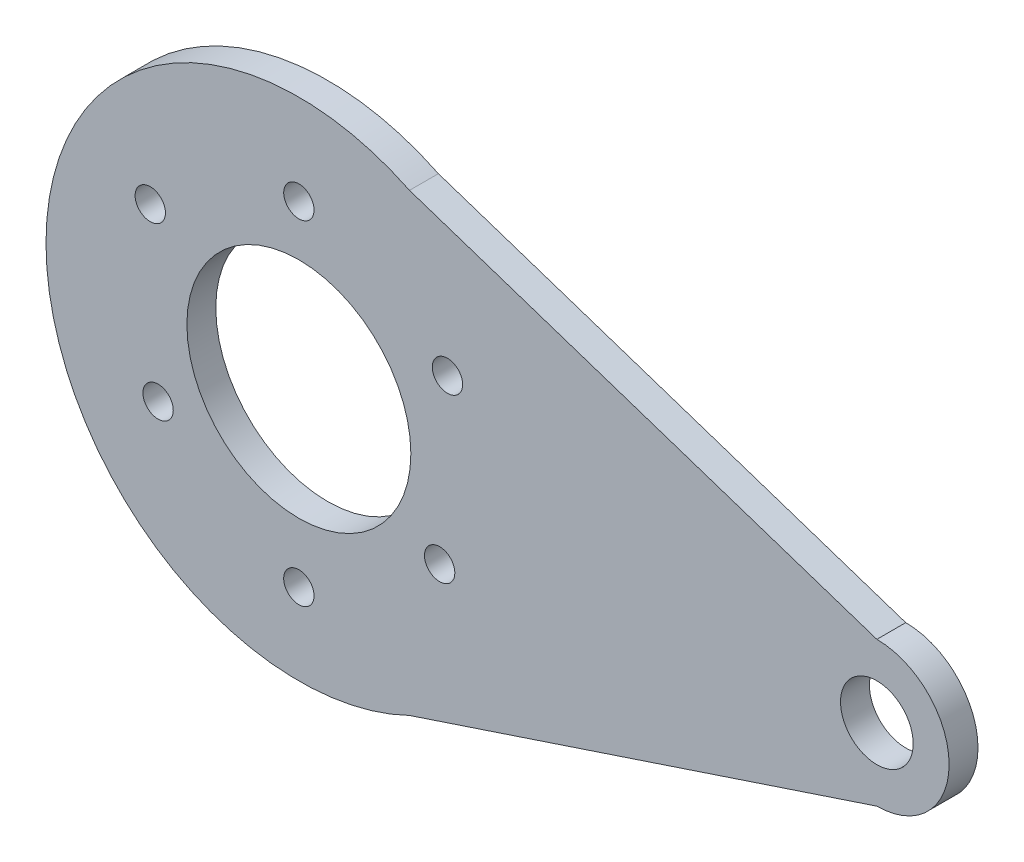
ISO-10303-21;
HEADER;
FILE_DESCRIPTION(('STEP AP214'),'2;1');
FILE_NAME('part.step','',(''),(''),'','','');
FILE_SCHEMA(('AUTOMOTIVE_DESIGN { 1 0 10303 214 1 1 1 1 }'));
ENDSEC;
DATA;
#1=APPLICATION_CONTEXT('core data for automotive mechanical design processes');
#2=APPLICATION_PROTOCOL_DEFINITION('international standard','automotive_design',2000,#1);
#3=PRODUCT_CONTEXT('',#1,'mechanical');
#4=PRODUCT('Part','Part','',(#3));
#5=PRODUCT_RELATED_PRODUCT_CATEGORY('part','',(#4));
#6=PRODUCT_DEFINITION_FORMATION('','',#4);
#7=PRODUCT_DEFINITION_CONTEXT('part definition',#1,'design');
#8=PRODUCT_DEFINITION('design','',#6,#7);
#9=PRODUCT_DEFINITION_SHAPE('','',#8);
#10=(LENGTH_UNIT() NAMED_UNIT(*) SI_UNIT(.MILLI.,.METRE.));
#11=(NAMED_UNIT(*) PLANE_ANGLE_UNIT() SI_UNIT($,.RADIAN.));
#12=(NAMED_UNIT(*) SI_UNIT($,.STERADIAN.) SOLID_ANGLE_UNIT());
#13=UNCERTAINTY_MEASURE_WITH_UNIT(LENGTH_MEASURE(1.E-05),#10,'distance_accuracy_value','');
#14=(GEOMETRIC_REPRESENTATION_CONTEXT(3) GLOBAL_UNCERTAINTY_ASSIGNED_CONTEXT((#13)) GLOBAL_UNIT_ASSIGNED_CONTEXT((#10,
#11,#12)) REPRESENTATION_CONTEXT('',''));
#15=CARTESIAN_POINT('',(0.,0.,0.));
#16=DIRECTION('',(0.,0.,1.));
#17=DIRECTION('',(1.,0.,0.));
#18=AXIS2_PLACEMENT_3D('',#15,#16,#17);
#19=CARTESIAN_POINT('',(82.5740743672686,-5.52758783429424,4.));
#20=DIRECTION('',(0.,0.,-1.));
#21=DIRECTION('',(-1.,0.,0.));
#22=AXIS2_PLACEMENT_3D('',#19,#20,#21);
#23=PLANE('',#22);
#24=CARTESIAN_POINT('',(82.5740743672686,-5.52758783429424,4.));
#25=DIRECTION('',(0.,0.,1.));
#26=DIRECTION('',(-1.,0.,0.));
#27=AXIS2_PLACEMENT_3D('',#24,#25,#26);
#28=CIRCLE('',#27,9.99999999999999);
#29=CARTESIAN_POINT('',(82.5740743672686,-15.5275878342942,4.));
#30=VERTEX_POINT('',#29);
#31=CARTESIAN_POINT('',(82.5740743672686,4.47241216570575,4.));
#32=VERTEX_POINT('',#31);
#33=EDGE_CURVE('E88',#30,#32,#28,.T.);
#34=ORIENTED_EDGE('',*,*,#33,.T.);
#35=DIRECTION('',(-0.949078057551367,0.315041014273577,0.));
#36=VECTOR('',#35,1.);
#37=CARTESIAN_POINT('',(82.5740743672686,4.47241216570575,4.));
#38=LINE('',#37,#36);
#39=CARTESIAN_POINT('',(17.8865743672686,25.9450565374455,4.));
#40=VERTEX_POINT('',#39);
#41=EDGE_CURVE('E83',#32,#40,#38,.T.);
#42=ORIENTED_EDGE('',*,*,#41,.T.);
#43=CARTESIAN_POINT('',(2.57407436726858,-5.52758783429424,4.));
#44=DIRECTION('',(0.,0.,1.));
#45=DIRECTION('',(1.,0.,0.));
#46=AXIS2_PLACEMENT_3D('',#43,#44,#45);
#47=CIRCLE('',#46,35.);
#48=CARTESIAN_POINT('',(17.8865743672686,-37.000232206034,4.));
#49=VERTEX_POINT('',#48);
#50=EDGE_CURVE('E86',#40,#49,#47,.T.);
#51=ORIENTED_EDGE('',*,*,#50,.T.);
#52=DIRECTION('',(0.949078057551367,0.315041014273577,0.));
#53=VECTOR('',#52,1.);
#54=CARTESIAN_POINT('',(17.8865743672686,-37.000232206034,4.));
#55=LINE('',#54,#53);
#56=EDGE_CURVE('E53',#49,#30,#55,.T.);
#57=ORIENTED_EDGE('',*,*,#56,.T.);
#58=EDGE_LOOP('',(#34,#42,#51,#57));
#59=FACE_BOUND('',#58,.T.);
#60=CARTESIAN_POINT('',(2.57407436726858,-29.2775878342943,4.));
#61=DIRECTION('',(0.,0.,1.));
#62=DIRECTION('',(1.,0.,0.));
#63=AXIS2_PLACEMENT_3D('',#60,#61,#62);
#64=CIRCLE('',#63,2.1);
#65=CARTESIAN_POINT('',(4.67407436726858,-29.2775878342943,4.));
#66=VERTEX_POINT('',#65);
#67=EDGE_CURVE('E103',#66,#66,#64,.T.);
#68=ORIENTED_EDGE('',*,*,#67,.F.);
#69=EDGE_LOOP('',(#68));
#70=FACE_BOUND('',#69,.T.);
#71=CARTESIAN_POINT('',(22.0596459524184,-16.7775878342942,4.));
#72=DIRECTION('',(0.,0.,1.));
#73=DIRECTION('',(1.,0.,0.));
#74=AXIS2_PLACEMENT_3D('',#71,#72,#73);
#75=CIRCLE('',#74,2.1);
#76=CARTESIAN_POINT('',(24.1596459524184,-16.7775878342942,4.));
#77=VERTEX_POINT('',#76);
#78=EDGE_CURVE('E118',#77,#77,#75,.T.);
#79=ORIENTED_EDGE('',*,*,#78,.F.);
#80=EDGE_LOOP('',(#79));
#81=FACE_BOUND('',#80,.T.);
#82=CARTESIAN_POINT('',(-17.9940289726118,6.34741216570586,4.));
#83=DIRECTION('',(0.,0.,1.));
#84=DIRECTION('',(1.,0.,0.));
#85=AXIS2_PLACEMENT_3D('',#82,#83,#84);
#86=CIRCLE('',#85,2.1);
#87=CARTESIAN_POINT('',(-15.8940289726118,6.34741216570586,4.));
#88=VERTEX_POINT('',#87);
#89=EDGE_CURVE('E124',#88,#88,#86,.T.);
#90=ORIENTED_EDGE('',*,*,#89,.F.);
#91=EDGE_LOOP('',(#90));
#92=FACE_BOUND('',#91,.T.);
#93=CARTESIAN_POINT('',(23.1421777071491,6.34741216570556,4.));
#94=DIRECTION('',(0.,0.,1.));
#95=DIRECTION('',(1.,0.,0.));
#96=AXIS2_PLACEMENT_3D('',#93,#94,#95);
#97=CIRCLE('',#96,2.1);
#98=CARTESIAN_POINT('',(25.2421777071491,6.34741216570556,4.));
#99=VERTEX_POINT('',#98);
#100=EDGE_CURVE('E130',#99,#99,#97,.T.);
#101=ORIENTED_EDGE('',*,*,#100,.F.);
#102=EDGE_LOOP('',(#101));
#103=FACE_BOUND('',#102,.T.);
#104=CARTESIAN_POINT('',(2.57407436726858,-5.52758783429424,4.));
#105=DIRECTION('',(0.,0.,1.));
#106=DIRECTION('',(1.,0.,0.));
#107=AXIS2_PLACEMENT_3D('',#104,#105,#106);
#108=CIRCLE('',#107,15.5);
#109=CARTESIAN_POINT('',(18.0740743672686,-5.52758783429424,4.));
#110=VERTEX_POINT('',#109);
#111=EDGE_CURVE('E136',#110,#110,#108,.T.);
#112=ORIENTED_EDGE('',*,*,#111,.F.);
#113=EDGE_LOOP('',(#112));
#114=FACE_BOUND('',#113,.T.);
#115=CARTESIAN_POINT('',(82.5740743672686,-5.52758783429424,4.));
#116=DIRECTION('',(0.,0.,1.));
#117=DIRECTION('',(1.,0.,0.));
#118=AXIS2_PLACEMENT_3D('',#115,#116,#117);
#119=CIRCLE('',#118,5.03000000000001);
#120=CARTESIAN_POINT('',(87.6040743672686,-5.52758783429424,4.));
#121=VERTEX_POINT('',#120);
#122=EDGE_CURVE('E142',#121,#121,#119,.T.);
#123=ORIENTED_EDGE('',*,*,#122,.F.);
#124=EDGE_LOOP('',(#123));
#125=FACE_BOUND('',#124,.T.);
#126=CARTESIAN_POINT('',(2.57407436726846,16.9724121657058,4.));
#127=DIRECTION('',(0.,0.,1.));
#128=DIRECTION('',(1.,0.,0.));
#129=AXIS2_PLACEMENT_3D('',#126,#127,#128);
#130=CIRCLE('',#129,2.1);
#131=CARTESIAN_POINT('',(4.67407436726846,16.9724121657058,4.));
#132=VERTEX_POINT('',#131);
#133=EDGE_CURVE('E148',#132,#132,#130,.T.);
#134=ORIENTED_EDGE('',*,*,#133,.F.);
#135=EDGE_LOOP('',(#134));
#136=FACE_BOUND('',#135,.T.);
#137=CARTESIAN_POINT('',(-16.9114972178812,-16.7775878342944,4.));
#138=DIRECTION('',(0.,0.,1.));
#139=DIRECTION('',(1.,0.,0.));
#140=AXIS2_PLACEMENT_3D('',#137,#138,#139);
#141=CIRCLE('',#140,2.1);
#142=CARTESIAN_POINT('',(-14.8114972178812,-16.7775878342944,4.));
#143=VERTEX_POINT('',#142);
#144=EDGE_CURVE('E154',#143,#143,#141,.T.);
#145=ORIENTED_EDGE('',*,*,#144,.F.);
#146=EDGE_LOOP('',(#145));
#147=FACE_BOUND('',#146,.T.);
#148=ADVANCED_FACE('F36',(#59,#70,#81,#92,#103,#114,#125,#136,#147),#23,.F.);
#149=CARTESIAN_POINT('',(82.5740743672686,-5.52758783429424,0.));
#150=DIRECTION('',(0.,0.,-1.));
#151=DIRECTION('',(-1.,0.,0.));
#152=AXIS2_PLACEMENT_3D('',#149,#150,#151);
#153=PLANE('',#152);
#154=CARTESIAN_POINT('',(2.57407436726846,16.9724121657058,0.));
#155=DIRECTION('',(0.,0.,1.));
#156=DIRECTION('',(1.,0.,0.));
#157=AXIS2_PLACEMENT_3D('',#154,#155,#156);
#158=CIRCLE('',#157,2.1);
#159=CARTESIAN_POINT('',(4.67407436726846,16.9724121657058,0.));
#160=VERTEX_POINT('',#159);
#161=EDGE_CURVE('E151',#160,#160,#158,.T.);
#162=ORIENTED_EDGE('',*,*,#161,.T.);
#163=EDGE_LOOP('',(#162));
#164=FACE_BOUND('',#163,.T.);
#165=CARTESIAN_POINT('',(2.57407436726858,-5.52758783429424,0.));
#166=DIRECTION('',(0.,0.,1.));
#167=DIRECTION('',(1.,0.,0.));
#168=AXIS2_PLACEMENT_3D('',#165,#166,#167);
#169=CIRCLE('',#168,15.5);
#170=CARTESIAN_POINT('',(18.0740743672686,-5.52758783429424,0.));
#171=VERTEX_POINT('',#170);
#172=EDGE_CURVE('E139',#171,#171,#169,.T.);
#173=ORIENTED_EDGE('',*,*,#172,.T.);
#174=EDGE_LOOP('',(#173));
#175=FACE_BOUND('',#174,.T.);
#176=CARTESIAN_POINT('',(-17.9940289726118,6.34741216570586,0.));
#177=DIRECTION('',(0.,0.,1.));
#178=DIRECTION('',(1.,0.,0.));
#179=AXIS2_PLACEMENT_3D('',#176,#177,#178);
#180=CIRCLE('',#179,2.1);
#181=CARTESIAN_POINT('',(-15.8940289726118,6.34741216570586,0.));
#182=VERTEX_POINT('',#181);
#183=EDGE_CURVE('E127',#182,#182,#180,.T.);
#184=ORIENTED_EDGE('',*,*,#183,.T.);
#185=EDGE_LOOP('',(#184));
#186=FACE_BOUND('',#185,.T.);
#187=CARTESIAN_POINT('',(2.57407436726858,-29.2775878342943,0.));
#188=DIRECTION('',(0.,0.,1.));
#189=DIRECTION('',(1.,0.,0.));
#190=AXIS2_PLACEMENT_3D('',#187,#188,#189);
#191=CIRCLE('',#190,2.1);
#192=CARTESIAN_POINT('',(4.67407436726858,-29.2775878342943,0.));
#193=VERTEX_POINT('',#192);
#194=EDGE_CURVE('E115',#193,#193,#191,.T.);
#195=ORIENTED_EDGE('',*,*,#194,.T.);
#196=EDGE_LOOP('',(#195));
#197=FACE_BOUND('',#196,.T.);
#198=CARTESIAN_POINT('',(82.5740743672686,-5.52758783429424,0.));
#199=DIRECTION('',(0.,0.,1.));
#200=DIRECTION('',(-1.,0.,0.));
#201=AXIS2_PLACEMENT_3D('',#198,#199,#200);
#202=CIRCLE('',#201,9.99999999999999);
#203=CARTESIAN_POINT('',(82.5740743672686,-15.5275878342942,0.));
#204=VERTEX_POINT('',#203);
#205=CARTESIAN_POINT('',(82.5740743672686,4.47241216570575,0.));
#206=VERTEX_POINT('',#205);
#207=EDGE_CURVE('E100',#204,#206,#202,.T.);
#208=ORIENTED_EDGE('',*,*,#207,.F.);
#209=DIRECTION('',(0.949078057551367,0.315041014273577,0.));
#210=VECTOR('',#209,1.);
#211=CARTESIAN_POINT('',(17.8865743672686,-37.000232206034,0.));
#212=LINE('',#211,#210);
#213=CARTESIAN_POINT('',(17.8865743672686,-37.000232206034,0.));
#214=VERTEX_POINT('',#213);
#215=EDGE_CURVE('E76',#214,#204,#212,.T.);
#216=ORIENTED_EDGE('',*,*,#215,.F.);
#217=CARTESIAN_POINT('',(2.57407436726858,-5.52758783429424,0.));
#218=DIRECTION('',(0.,0.,1.));
#219=DIRECTION('',(1.,0.,0.));
#220=AXIS2_PLACEMENT_3D('',#217,#218,#219);
#221=CIRCLE('',#220,35.);
#222=CARTESIAN_POINT('',(17.8865743672686,25.9450565374455,0.));
#223=VERTEX_POINT('',#222);
#224=EDGE_CURVE('E70',#223,#214,#221,.T.);
#225=ORIENTED_EDGE('',*,*,#224,.F.);
#226=DIRECTION('',(-0.949078057551367,0.315041014273577,0.));
#227=VECTOR('',#226,1.);
#228=CARTESIAN_POINT('',(82.5740743672686,4.47241216570575,0.));
#229=LINE('',#228,#227);
#230=EDGE_CURVE('E92',#206,#223,#229,.T.);
#231=ORIENTED_EDGE('',*,*,#230,.F.);
#232=EDGE_LOOP('',(#208,#216,#225,#231));
#233=FACE_BOUND('',#232,.T.);
#234=CARTESIAN_POINT('',(22.0596459524184,-16.7775878342942,0.));
#235=DIRECTION('',(0.,0.,1.));
#236=DIRECTION('',(1.,0.,0.));
#237=AXIS2_PLACEMENT_3D('',#234,#235,#236);
#238=CIRCLE('',#237,2.1);
#239=CARTESIAN_POINT('',(24.1596459524184,-16.7775878342942,0.));
#240=VERTEX_POINT('',#239);
#241=EDGE_CURVE('E121',#240,#240,#238,.T.);
#242=ORIENTED_EDGE('',*,*,#241,.T.);
#243=EDGE_LOOP('',(#242));
#244=FACE_BOUND('',#243,.T.);
#245=CARTESIAN_POINT('',(23.1421777071491,6.34741216570556,0.));
#246=DIRECTION('',(0.,0.,1.));
#247=DIRECTION('',(1.,0.,0.));
#248=AXIS2_PLACEMENT_3D('',#245,#246,#247);
#249=CIRCLE('',#248,2.1);
#250=CARTESIAN_POINT('',(25.2421777071491,6.34741216570556,0.));
#251=VERTEX_POINT('',#250);
#252=EDGE_CURVE('E133',#251,#251,#249,.T.);
#253=ORIENTED_EDGE('',*,*,#252,.T.);
#254=EDGE_LOOP('',(#253));
#255=FACE_BOUND('',#254,.T.);
#256=CARTESIAN_POINT('',(82.5740743672686,-5.52758783429424,0.));
#257=DIRECTION('',(0.,0.,1.));
#258=DIRECTION('',(1.,0.,0.));
#259=AXIS2_PLACEMENT_3D('',#256,#257,#258);
#260=CIRCLE('',#259,5.03000000000001);
#261=CARTESIAN_POINT('',(87.6040743672686,-5.52758783429424,0.));
#262=VERTEX_POINT('',#261);
#263=EDGE_CURVE('E145',#262,#262,#260,.T.);
#264=ORIENTED_EDGE('',*,*,#263,.T.);
#265=EDGE_LOOP('',(#264));
#266=FACE_BOUND('',#265,.T.);
#267=CARTESIAN_POINT('',(-16.9114972178812,-16.7775878342944,0.));
#268=DIRECTION('',(0.,0.,1.));
#269=DIRECTION('',(1.,0.,0.));
#270=AXIS2_PLACEMENT_3D('',#267,#268,#269);
#271=CIRCLE('',#270,2.1);
#272=CARTESIAN_POINT('',(-14.8114972178812,-16.7775878342944,0.));
#273=VERTEX_POINT('',#272);
#274=EDGE_CURVE('E157',#273,#273,#271,.T.);
#275=ORIENTED_EDGE('',*,*,#274,.T.);
#276=EDGE_LOOP('',(#275));
#277=FACE_BOUND('',#276,.T.);
#278=ADVANCED_FACE('F111',(#164,#175,#186,#197,#233,#244,#255,#266,#277),#153,.T.);
#279=CARTESIAN_POINT('',(82.5740743672686,-5.52758783429424,4.));
#280=DIRECTION('',(0.,0.,-1.));
#281=DIRECTION('',(-1.,0.,0.));
#282=AXIS2_PLACEMENT_3D('',#279,#280,#281);
#283=CYLINDRICAL_SURFACE('',#282,9.99999999999999);
#284=ORIENTED_EDGE('',*,*,#207,.T.);
#285=DIRECTION('',(0.,0.,-1.));
#286=VECTOR('',#285,1.);
#287=CARTESIAN_POINT('',(82.5740743672686,4.47241216570575,4.));
#288=LINE('',#287,#286);
#289=EDGE_CURVE('E11',#32,#206,#288,.T.);
#290=ORIENTED_EDGE('',*,*,#289,.F.);
#291=ORIENTED_EDGE('',*,*,#33,.F.);
#292=DIRECTION('',(0.,0.,-1.));
#293=VECTOR('',#292,1.);
#294=CARTESIAN_POINT('',(82.5740743672686,-15.5275878342942,4.));
#295=LINE('',#294,#293);
#296=EDGE_CURVE('E96',#30,#204,#295,.T.);
#297=ORIENTED_EDGE('',*,*,#296,.T.);
#298=EDGE_LOOP('',(#284,#290,#291,#297));
#299=FACE_BOUND('',#298,.T.);
#300=ADVANCED_FACE('F38',(#299),#283,.T.);
#301=CARTESIAN_POINT('',(82.5740743672686,4.47241216570575,4.));
#302=DIRECTION('',(-0.315041014273577,-0.949078057551367,0.));
#303=DIRECTION('',(0.949078057551367,-0.315041014273577,0.));
#304=AXIS2_PLACEMENT_3D('',#301,#302,#303);
#305=PLANE('',#304);
#306=ORIENTED_EDGE('',*,*,#230,.T.);
#307=DIRECTION('',(0.,0.,-1.));
#308=VECTOR('',#307,1.);
#309=CARTESIAN_POINT('',(17.8865743672686,25.9450565374455,4.));
#310=LINE('',#309,#308);
#311=EDGE_CURVE('E45',#40,#223,#310,.T.);
#312=ORIENTED_EDGE('',*,*,#311,.F.);
#313=ORIENTED_EDGE('',*,*,#41,.F.);
#314=ORIENTED_EDGE('',*,*,#289,.T.);
#315=EDGE_LOOP('',(#306,#312,#313,#314));
#316=FACE_BOUND('',#315,.T.);
#317=ADVANCED_FACE('F91',(#316),#305,.F.);
#318=CARTESIAN_POINT('',(2.57407436726858,-5.52758783429424,4.));
#319=DIRECTION('',(0.,0.,-1.));
#320=DIRECTION('',(-1.,0.,0.));
#321=AXIS2_PLACEMENT_3D('',#318,#319,#320);
#322=CYLINDRICAL_SURFACE('',#321,35.);
#323=ORIENTED_EDGE('',*,*,#224,.T.);
#324=DIRECTION('',(0.,0.,-1.));
#325=VECTOR('',#324,1.);
#326=CARTESIAN_POINT('',(17.8865743672686,-37.000232206034,4.));
#327=LINE('',#326,#325);
#328=EDGE_CURVE('E93',#49,#214,#327,.T.);
#329=ORIENTED_EDGE('',*,*,#328,.F.);
#330=ORIENTED_EDGE('',*,*,#50,.F.);
#331=ORIENTED_EDGE('',*,*,#311,.T.);
#332=EDGE_LOOP('',(#323,#329,#330,#331));
#333=FACE_BOUND('',#332,.T.);
#334=ADVANCED_FACE('F94',(#333),#322,.T.);
#335=CARTESIAN_POINT('',(17.8865743672686,-37.000232206034,4.));
#336=DIRECTION('',(-0.315041014273577,0.949078057551367,0.));
#337=DIRECTION('',(-0.949078057551367,-0.315041014273577,0.));
#338=AXIS2_PLACEMENT_3D('',#335,#336,#337);
#339=PLANE('',#338);
#340=ORIENTED_EDGE('',*,*,#215,.T.);
#341=ORIENTED_EDGE('',*,*,#296,.F.);
#342=ORIENTED_EDGE('',*,*,#56,.F.);
#343=ORIENTED_EDGE('',*,*,#328,.T.);
#344=EDGE_LOOP('',(#340,#341,#342,#343));
#345=FACE_BOUND('',#344,.T.);
#346=ADVANCED_FACE('F108',(#345),#339,.F.);
#347=CARTESIAN_POINT('',(2.57407436726858,-29.2775878342943,4.));
#348=DIRECTION('',(0.,0.,-1.));
#349=DIRECTION('',(-1.,0.,0.));
#350=AXIS2_PLACEMENT_3D('',#347,#348,#349);
#351=CYLINDRICAL_SURFACE('',#350,2.1);
#352=ORIENTED_EDGE('',*,*,#67,.T.);
#353=EDGE_LOOP('',(#352));
#354=FACE_BOUND('',#353,.T.);
#355=ORIENTED_EDGE('',*,*,#194,.F.);
#356=EDGE_LOOP('',(#355));
#357=FACE_BOUND('',#356,.T.);
#358=ADVANCED_FACE('F174',(#354,#357),#351,.F.);
#359=CARTESIAN_POINT('',(22.0596459524184,-16.7775878342942,4.));
#360=DIRECTION('',(0.,0.,-1.));
#361=DIRECTION('',(-1.,0.,0.));
#362=AXIS2_PLACEMENT_3D('',#359,#360,#361);
#363=CYLINDRICAL_SURFACE('',#362,2.1);
#364=ORIENTED_EDGE('',*,*,#78,.T.);
#365=EDGE_LOOP('',(#364));
#366=FACE_BOUND('',#365,.T.);
#367=ORIENTED_EDGE('',*,*,#241,.F.);
#368=EDGE_LOOP('',(#367));
#369=FACE_BOUND('',#368,.T.);
#370=ADVANCED_FACE('F220',(#366,#369),#363,.F.);
#371=CARTESIAN_POINT('',(-17.9940289726118,6.34741216570586,4.));
#372=DIRECTION('',(0.,0.,-1.));
#373=DIRECTION('',(-1.,0.,0.));
#374=AXIS2_PLACEMENT_3D('',#371,#372,#373);
#375=CYLINDRICAL_SURFACE('',#374,2.1);
#376=ORIENTED_EDGE('',*,*,#89,.T.);
#377=EDGE_LOOP('',(#376));
#378=FACE_BOUND('',#377,.T.);
#379=ORIENTED_EDGE('',*,*,#183,.F.);
#380=EDGE_LOOP('',(#379));
#381=FACE_BOUND('',#380,.T.);
#382=ADVANCED_FACE('F228',(#378,#381),#375,.F.);
#383=CARTESIAN_POINT('',(23.1421777071491,6.34741216570556,4.));
#384=DIRECTION('',(0.,0.,-1.));
#385=DIRECTION('',(-1.,0.,0.));
#386=AXIS2_PLACEMENT_3D('',#383,#384,#385);
#387=CYLINDRICAL_SURFACE('',#386,2.1);
#388=ORIENTED_EDGE('',*,*,#100,.T.);
#389=EDGE_LOOP('',(#388));
#390=FACE_BOUND('',#389,.T.);
#391=ORIENTED_EDGE('',*,*,#252,.F.);
#392=EDGE_LOOP('',(#391));
#393=FACE_BOUND('',#392,.T.);
#394=ADVANCED_FACE('F236',(#390,#393),#387,.F.);
#395=CARTESIAN_POINT('',(2.57407436726858,-5.52758783429424,4.));
#396=DIRECTION('',(0.,0.,-1.));
#397=DIRECTION('',(-1.,0.,0.));
#398=AXIS2_PLACEMENT_3D('',#395,#396,#397);
#399=CYLINDRICAL_SURFACE('',#398,15.5);
#400=ORIENTED_EDGE('',*,*,#111,.T.);
#401=EDGE_LOOP('',(#400));
#402=FACE_BOUND('',#401,.T.);
#403=ORIENTED_EDGE('',*,*,#172,.F.);
#404=EDGE_LOOP('',(#403));
#405=FACE_BOUND('',#404,.T.);
#406=ADVANCED_FACE('F245',(#402,#405),#399,.F.);
#407=CARTESIAN_POINT('',(82.5740743672686,-5.52758783429424,4.));
#408=DIRECTION('',(0.,0.,-1.));
#409=DIRECTION('',(-1.,0.,0.));
#410=AXIS2_PLACEMENT_3D('',#407,#408,#409);
#411=CYLINDRICAL_SURFACE('',#410,5.03000000000001);
#412=ORIENTED_EDGE('',*,*,#122,.T.);
#413=EDGE_LOOP('',(#412));
#414=FACE_BOUND('',#413,.T.);
#415=ORIENTED_EDGE('',*,*,#263,.F.);
#416=EDGE_LOOP('',(#415));
#417=FACE_BOUND('',#416,.T.);
#418=ADVANCED_FACE('F254',(#414,#417),#411,.F.);
#419=CARTESIAN_POINT('',(2.57407436726846,16.9724121657058,4.));
#420=DIRECTION('',(0.,0.,-1.));
#421=DIRECTION('',(-1.,0.,0.));
#422=AXIS2_PLACEMENT_3D('',#419,#420,#421);
#423=CYLINDRICAL_SURFACE('',#422,2.1);
#424=ORIENTED_EDGE('',*,*,#133,.T.);
#425=EDGE_LOOP('',(#424));
#426=FACE_BOUND('',#425,.T.);
#427=ORIENTED_EDGE('',*,*,#161,.F.);
#428=EDGE_LOOP('',(#427));
#429=FACE_BOUND('',#428,.T.);
#430=ADVANCED_FACE('F263',(#426,#429),#423,.F.);
#431=CARTESIAN_POINT('',(-16.9114972178812,-16.7775878342944,4.));
#432=DIRECTION('',(0.,0.,-1.));
#433=DIRECTION('',(-1.,0.,0.));
#434=AXIS2_PLACEMENT_3D('',#431,#432,#433);
#435=CYLINDRICAL_SURFACE('',#434,2.1);
#436=ORIENTED_EDGE('',*,*,#144,.T.);
#437=EDGE_LOOP('',(#436));
#438=FACE_BOUND('',#437,.T.);
#439=ORIENTED_EDGE('',*,*,#274,.F.);
#440=EDGE_LOOP('',(#439));
#441=FACE_BOUND('',#440,.T.);
#442=ADVANCED_FACE('F163',(#438,#441),#435,.F.);
#443=CLOSED_SHELL('',(#148,#278,#300,#317,#334,#346,#358,#370,#382,#394,#406,#418,#430,#442));
#444=MANIFOLD_SOLID_BREP('B2',#443);
#445=ADVANCED_BREP_SHAPE_REPRESENTATION('',(#18,#444),#14);
#446=SHAPE_DEFINITION_REPRESENTATION(#9,#445);
ENDSEC;
END-ISO-10303-21;
